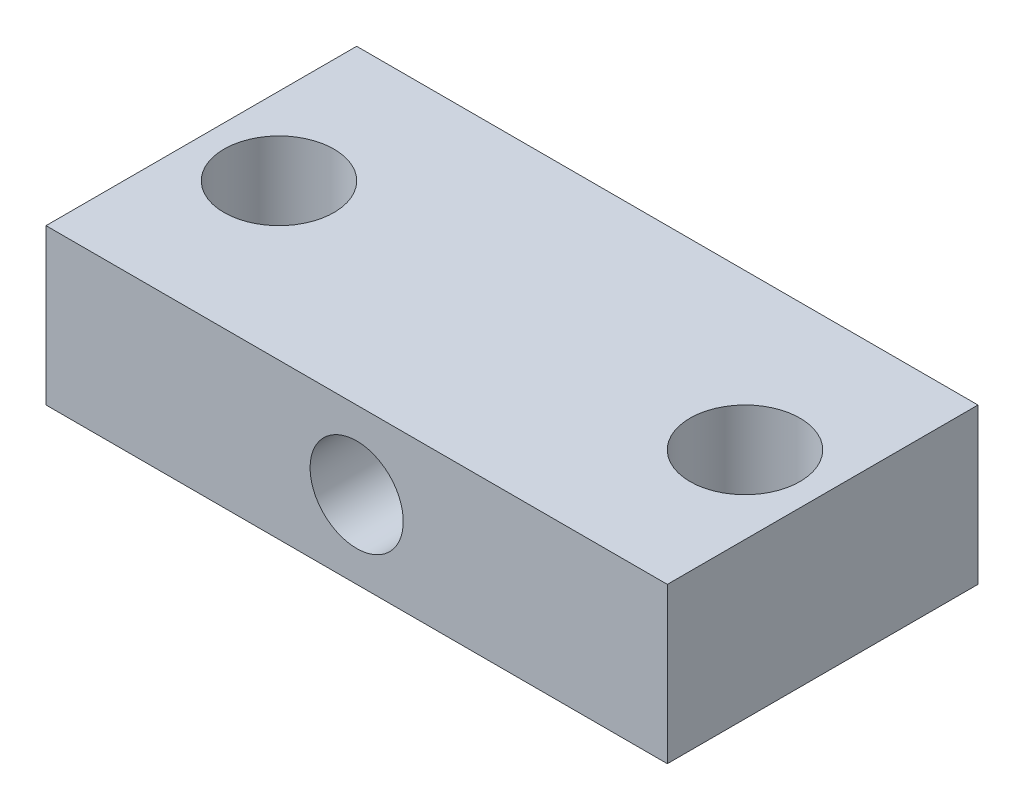
ISO-10303-21;
HEADER;
FILE_DESCRIPTION(('STEP AP214'),'2;1');
FILE_NAME('part.step','',(''),(''),'','','');
FILE_SCHEMA(('AUTOMOTIVE_DESIGN { 1 0 10303 214 1 1 1 1 }'));
ENDSEC;
DATA;
#1=APPLICATION_CONTEXT('core data for automotive mechanical design processes');
#2=APPLICATION_PROTOCOL_DEFINITION('international standard','automotive_design',2000,#1);
#3=PRODUCT_CONTEXT('',#1,'mechanical');
#4=PRODUCT('Part','Part','',(#3));
#5=PRODUCT_RELATED_PRODUCT_CATEGORY('part','',(#4));
#6=PRODUCT_DEFINITION_FORMATION('','',#4);
#7=PRODUCT_DEFINITION_CONTEXT('part definition',#1,'design');
#8=PRODUCT_DEFINITION('design','',#6,#7);
#9=PRODUCT_DEFINITION_SHAPE('','',#8);
#10=(LENGTH_UNIT() NAMED_UNIT(*) SI_UNIT(.MILLI.,.METRE.));
#11=(NAMED_UNIT(*) PLANE_ANGLE_UNIT() SI_UNIT($,.RADIAN.));
#12=(NAMED_UNIT(*) SI_UNIT($,.STERADIAN.) SOLID_ANGLE_UNIT());
#13=UNCERTAINTY_MEASURE_WITH_UNIT(LENGTH_MEASURE(1.E-05),#10,'distance_accuracy_value','');
#14=(GEOMETRIC_REPRESENTATION_CONTEXT(3) GLOBAL_UNCERTAINTY_ASSIGNED_CONTEXT((#13)) GLOBAL_UNIT_ASSIGNED_CONTEXT((#10,
#11,#12)) REPRESENTATION_CONTEXT('',''));
#15=CARTESIAN_POINT('',(0.,0.,0.));
#16=DIRECTION('',(0.,0.,1.));
#17=DIRECTION('',(1.,0.,0.));
#18=AXIS2_PLACEMENT_3D('',#15,#16,#17);
#19=CARTESIAN_POINT('',(0.,0.,0.));
#20=DIRECTION('',(0.,-1.,0.));
#21=DIRECTION('',(0.,0.,-1.));
#22=AXIS2_PLACEMENT_3D('',#19,#20,#21);
#23=PLANE('',#22);
#24=CARTESIAN_POINT('',(-9.525,0.,0.));
#25=DIRECTION('',(0.,1.,0.));
#26=DIRECTION('',(0.,0.,1.));
#27=AXIS2_PLACEMENT_3D('',#24,#25,#26);
#28=CIRCLE('',#27,2.2479);
#29=CARTESIAN_POINT('',(-9.525,0.,2.2479));
#30=VERTEX_POINT('',#29);
#31=EDGE_CURVE('E150',#30,#30,#28,.T.);
#32=ORIENTED_EDGE('',*,*,#31,.T.);
#33=EDGE_LOOP('',(#32));
#34=FACE_BOUND('',#33,.T.);
#35=DIRECTION('',(0.,0.,-1.));
#36=VECTOR('',#35,1.);
#37=CARTESIAN_POINT('',(12.7,0.,6.35));
#38=LINE('',#37,#36);
#39=CARTESIAN_POINT('',(12.7,0.,6.35));
#40=VERTEX_POINT('',#39);
#41=CARTESIAN_POINT('',(12.7,0.,-6.35));
#42=VERTEX_POINT('',#41);
#43=EDGE_CURVE('E114',#40,#42,#38,.T.);
#44=ORIENTED_EDGE('',*,*,#43,.F.);
#45=DIRECTION('',(1.,0.,0.));
#46=VECTOR('',#45,1.);
#47=CARTESIAN_POINT('',(-12.7,0.,6.35));
#48=LINE('',#47,#46);
#49=CARTESIAN_POINT('',(-12.7,0.,6.35));
#50=VERTEX_POINT('',#49);
#51=EDGE_CURVE('E85',#50,#40,#48,.T.);
#52=ORIENTED_EDGE('',*,*,#51,.F.);
#53=DIRECTION('',(0.,0.,1.));
#54=VECTOR('',#53,1.);
#55=CARTESIAN_POINT('',(-12.7,0.,6.35));
#56=LINE('',#55,#54);
#57=CARTESIAN_POINT('',(-12.7,0.,-6.35));
#58=VERTEX_POINT('',#57);
#59=EDGE_CURVE('E79',#58,#50,#56,.T.);
#60=ORIENTED_EDGE('',*,*,#59,.F.);
#61=DIRECTION('',(-1.,0.,0.));
#62=VECTOR('',#61,1.);
#63=CARTESIAN_POINT('',(-12.7,0.,-6.35));
#64=LINE('',#63,#62);
#65=EDGE_CURVE('E103',#42,#58,#64,.T.);
#66=ORIENTED_EDGE('',*,*,#65,.F.);
#67=EDGE_LOOP('',(#44,#52,#60,#66));
#68=FACE_BOUND('',#67,.T.);
#69=CARTESIAN_POINT('',(9.525,0.,0.));
#70=DIRECTION('',(0.,1.,0.));
#71=DIRECTION('',(0.,0.,1.));
#72=AXIS2_PLACEMENT_3D('',#69,#70,#71);
#73=CIRCLE('',#72,2.2479);
#74=CARTESIAN_POINT('',(9.525,0.,2.2479));
#75=VERTEX_POINT('',#74);
#76=EDGE_CURVE('E139',#75,#75,#73,.T.);
#77=ORIENTED_EDGE('',*,*,#76,.T.);
#78=EDGE_LOOP('',(#77));
#79=FACE_BOUND('',#78,.T.);
#80=ADVANCED_FACE('F44',(#34,#68,#79),#23,.T.);
#81=CARTESIAN_POINT('',(0.,6.35,0.));
#82=DIRECTION('',(0.,-1.,0.));
#83=DIRECTION('',(0.,0.,-1.));
#84=AXIS2_PLACEMENT_3D('',#81,#82,#83);
#85=PLANE('',#84);
#86=CARTESIAN_POINT('',(-9.525,6.35,0.));
#87=DIRECTION('',(0.,1.,0.));
#88=DIRECTION('',(0.,0.,1.));
#89=AXIS2_PLACEMENT_3D('',#86,#87,#88);
#90=CIRCLE('',#89,2.2479);
#91=CARTESIAN_POINT('',(-9.525,6.35,2.2479));
#92=VERTEX_POINT('',#91);
#93=EDGE_CURVE('E154',#92,#92,#90,.T.);
#94=ORIENTED_EDGE('',*,*,#93,.F.);
#95=EDGE_LOOP('',(#94));
#96=FACE_BOUND('',#95,.T.);
#97=DIRECTION('',(0.,0.,-1.));
#98=VECTOR('',#97,1.);
#99=CARTESIAN_POINT('',(12.7,6.35,6.35));
#100=LINE('',#99,#98);
#101=CARTESIAN_POINT('',(12.7,6.35,6.35));
#102=VERTEX_POINT('',#101);
#103=CARTESIAN_POINT('',(12.7,6.35,-6.35));
#104=VERTEX_POINT('',#103);
#105=EDGE_CURVE('E98',#102,#104,#100,.T.);
#106=ORIENTED_EDGE('',*,*,#105,.T.);
#107=DIRECTION('',(-1.,0.,0.));
#108=VECTOR('',#107,1.);
#109=CARTESIAN_POINT('',(-12.7,6.35,-6.35));
#110=LINE('',#109,#108);
#111=CARTESIAN_POINT('',(-12.7,6.35,-6.35));
#112=VERTEX_POINT('',#111);
#113=EDGE_CURVE('E92',#104,#112,#110,.T.);
#114=ORIENTED_EDGE('',*,*,#113,.T.);
#115=DIRECTION('',(0.,0.,1.));
#116=VECTOR('',#115,1.);
#117=CARTESIAN_POINT('',(-12.7,6.35,6.35));
#118=LINE('',#117,#116);
#119=CARTESIAN_POINT('',(-12.7,6.35,6.35));
#120=VERTEX_POINT('',#119);
#121=EDGE_CURVE('E96',#112,#120,#118,.T.);
#122=ORIENTED_EDGE('',*,*,#121,.T.);
#123=DIRECTION('',(1.,0.,0.));
#124=VECTOR('',#123,1.);
#125=CARTESIAN_POINT('',(-12.7,6.35,6.35));
#126=LINE('',#125,#124);
#127=EDGE_CURVE('E62',#120,#102,#126,.T.);
#128=ORIENTED_EDGE('',*,*,#127,.T.);
#129=EDGE_LOOP('',(#106,#114,#122,#128));
#130=FACE_BOUND('',#129,.T.);
#131=CARTESIAN_POINT('',(9.525,6.35,0.));
#132=DIRECTION('',(0.,1.,0.));
#133=DIRECTION('',(0.,0.,1.));
#134=AXIS2_PLACEMENT_3D('',#131,#132,#133);
#135=CIRCLE('',#134,2.2479);
#136=CARTESIAN_POINT('',(9.525,6.35,2.2479));
#137=VERTEX_POINT('',#136);
#138=EDGE_CURVE('E146',#137,#137,#135,.T.);
#139=ORIENTED_EDGE('',*,*,#138,.F.);
#140=EDGE_LOOP('',(#139));
#141=FACE_BOUND('',#140,.T.);
#142=ADVANCED_FACE('F93',(#96,#130,#141),#85,.F.);
#143=CARTESIAN_POINT('',(12.7,6.35,6.35));
#144=DIRECTION('',(-1.,0.,0.));
#145=DIRECTION('',(0.,0.,1.));
#146=AXIS2_PLACEMENT_3D('',#143,#144,#145);
#147=PLANE('',#146);
#148=ORIENTED_EDGE('',*,*,#43,.T.);
#149=DIRECTION('',(0.,-1.,0.));
#150=VECTOR('',#149,1.);
#151=CARTESIAN_POINT('',(12.7,6.35,-6.35));
#152=LINE('',#151,#150);
#153=EDGE_CURVE('E11',#104,#42,#152,.T.);
#154=ORIENTED_EDGE('',*,*,#153,.F.);
#155=ORIENTED_EDGE('',*,*,#105,.F.);
#156=DIRECTION('',(0.,-1.,0.));
#157=VECTOR('',#156,1.);
#158=CARTESIAN_POINT('',(12.7,6.35,6.35));
#159=LINE('',#158,#157);
#160=EDGE_CURVE('E110',#102,#40,#159,.T.);
#161=ORIENTED_EDGE('',*,*,#160,.T.);
#162=EDGE_LOOP('',(#148,#154,#155,#161));
#163=FACE_BOUND('',#162,.T.);
#164=ADVANCED_FACE('F46',(#163),#147,.F.);
#165=CARTESIAN_POINT('',(-12.7,6.35,-6.35));
#166=DIRECTION('',(0.,0.,1.));
#167=DIRECTION('',(1.,0.,0.));
#168=AXIS2_PLACEMENT_3D('',#165,#166,#167);
#169=PLANE('',#168);
#170=CARTESIAN_POINT('',(0.,3.175,-6.35));
#171=DIRECTION('',(0.,0.,-1.));
#172=DIRECTION('',(-1.,0.,0.));
#173=AXIS2_PLACEMENT_3D('',#170,#171,#172);
#174=CIRCLE('',#173,1.905);
#175=CARTESIAN_POINT('',(-1.905,3.175,-6.35));
#176=VERTEX_POINT('',#175);
#177=EDGE_CURVE('E135',#176,#176,#174,.T.);
#178=ORIENTED_EDGE('',*,*,#177,.F.);
#179=EDGE_LOOP('',(#178));
#180=FACE_BOUND('',#179,.T.);
#181=ORIENTED_EDGE('',*,*,#65,.T.);
#182=DIRECTION('',(0.,-1.,0.));
#183=VECTOR('',#182,1.);
#184=CARTESIAN_POINT('',(-12.7,6.35,-6.35));
#185=LINE('',#184,#183);
#186=EDGE_CURVE('E54',#112,#58,#185,.T.);
#187=ORIENTED_EDGE('',*,*,#186,.F.);
#188=ORIENTED_EDGE('',*,*,#113,.F.);
#189=ORIENTED_EDGE('',*,*,#153,.T.);
#190=EDGE_LOOP('',(#181,#187,#188,#189));
#191=FACE_BOUND('',#190,.T.);
#192=ADVANCED_FACE('F102',(#180,#191),#169,.F.);
#193=CARTESIAN_POINT('',(-12.7,6.35,6.35));
#194=DIRECTION('',(1.,0.,0.));
#195=DIRECTION('',(0.,0.,-1.));
#196=AXIS2_PLACEMENT_3D('',#193,#194,#195);
#197=PLANE('',#196);
#198=ORIENTED_EDGE('',*,*,#59,.T.);
#199=DIRECTION('',(0.,-1.,0.));
#200=VECTOR('',#199,1.);
#201=CARTESIAN_POINT('',(-12.7,6.35,6.35));
#202=LINE('',#201,#200);
#203=EDGE_CURVE('E105',#120,#50,#202,.T.);
#204=ORIENTED_EDGE('',*,*,#203,.F.);
#205=ORIENTED_EDGE('',*,*,#121,.F.);
#206=ORIENTED_EDGE('',*,*,#186,.T.);
#207=EDGE_LOOP('',(#198,#204,#205,#206));
#208=FACE_BOUND('',#207,.T.);
#209=ADVANCED_FACE('F106',(#208),#197,.F.);
#210=CARTESIAN_POINT('',(-12.7,6.35,6.35));
#211=DIRECTION('',(0.,0.,-1.));
#212=DIRECTION('',(-1.,0.,0.));
#213=AXIS2_PLACEMENT_3D('',#210,#211,#212);
#214=PLANE('',#213);
#215=CARTESIAN_POINT('',(0.,3.175,6.35));
#216=DIRECTION('',(0.,0.,-1.));
#217=DIRECTION('',(-1.,0.,0.));
#218=AXIS2_PLACEMENT_3D('',#215,#216,#217);
#219=CIRCLE('',#218,1.905);
#220=CARTESIAN_POINT('',(-1.905,3.175,6.35));
#221=VERTEX_POINT('',#220);
#222=EDGE_CURVE('E118',#221,#221,#219,.T.);
#223=ORIENTED_EDGE('',*,*,#222,.T.);
#224=EDGE_LOOP('',(#223));
#225=FACE_BOUND('',#224,.T.);
#226=ORIENTED_EDGE('',*,*,#51,.T.);
#227=ORIENTED_EDGE('',*,*,#160,.F.);
#228=ORIENTED_EDGE('',*,*,#127,.F.);
#229=ORIENTED_EDGE('',*,*,#203,.T.);
#230=EDGE_LOOP('',(#226,#227,#228,#229));
#231=FACE_BOUND('',#230,.T.);
#232=ADVANCED_FACE('F128',(#225,#231),#214,.F.);
#233=CARTESIAN_POINT('',(0.,3.175,6.35));
#234=DIRECTION('',(0.,0.,-1.));
#235=DIRECTION('',(-1.,0.,0.));
#236=AXIS2_PLACEMENT_3D('',#233,#234,#235);
#237=CYLINDRICAL_SURFACE('',#236,1.905);
#238=ORIENTED_EDGE('',*,*,#222,.F.);
#239=EDGE_LOOP('',(#238));
#240=FACE_BOUND('',#239,.T.);
#241=ORIENTED_EDGE('',*,*,#177,.T.);
#242=EDGE_LOOP('',(#241));
#243=FACE_BOUND('',#242,.T.);
#244=ADVANCED_FACE('F171',(#240,#243),#237,.F.);
#245=CARTESIAN_POINT('',(9.525,6.35,0.));
#246=DIRECTION('',(0.,1.,0.));
#247=DIRECTION('',(0.,0.,1.));
#248=AXIS2_PLACEMENT_3D('',#245,#246,#247);
#249=CYLINDRICAL_SURFACE('',#248,2.2479);
#250=ORIENTED_EDGE('',*,*,#76,.F.);
#251=EDGE_LOOP('',(#250));
#252=FACE_BOUND('',#251,.T.);
#253=ORIENTED_EDGE('',*,*,#138,.T.);
#254=EDGE_LOOP('',(#253));
#255=FACE_BOUND('',#254,.T.);
#256=ADVANCED_FACE('F185',(#252,#255),#249,.F.);
#257=CARTESIAN_POINT('',(-9.525,6.35,0.));
#258=DIRECTION('',(0.,1.,0.));
#259=DIRECTION('',(0.,0.,1.));
#260=AXIS2_PLACEMENT_3D('',#257,#258,#259);
#261=CYLINDRICAL_SURFACE('',#260,2.2479);
#262=ORIENTED_EDGE('',*,*,#31,.F.);
#263=EDGE_LOOP('',(#262));
#264=FACE_BOUND('',#263,.T.);
#265=ORIENTED_EDGE('',*,*,#93,.T.);
#266=EDGE_LOOP('',(#265));
#267=FACE_BOUND('',#266,.T.);
#268=ADVANCED_FACE('F159',(#264,#267),#261,.F.);
#269=CLOSED_SHELL('',(#80,#142,#164,#192,#209,#232,#244,#256,#268));
#270=MANIFOLD_SOLID_BREP('B2',#269);
#271=ADVANCED_BREP_SHAPE_REPRESENTATION('',(#18,#270),#14);
#272=SHAPE_DEFINITION_REPRESENTATION(#9,#271);
ENDSEC;
END-ISO-10303-21;
